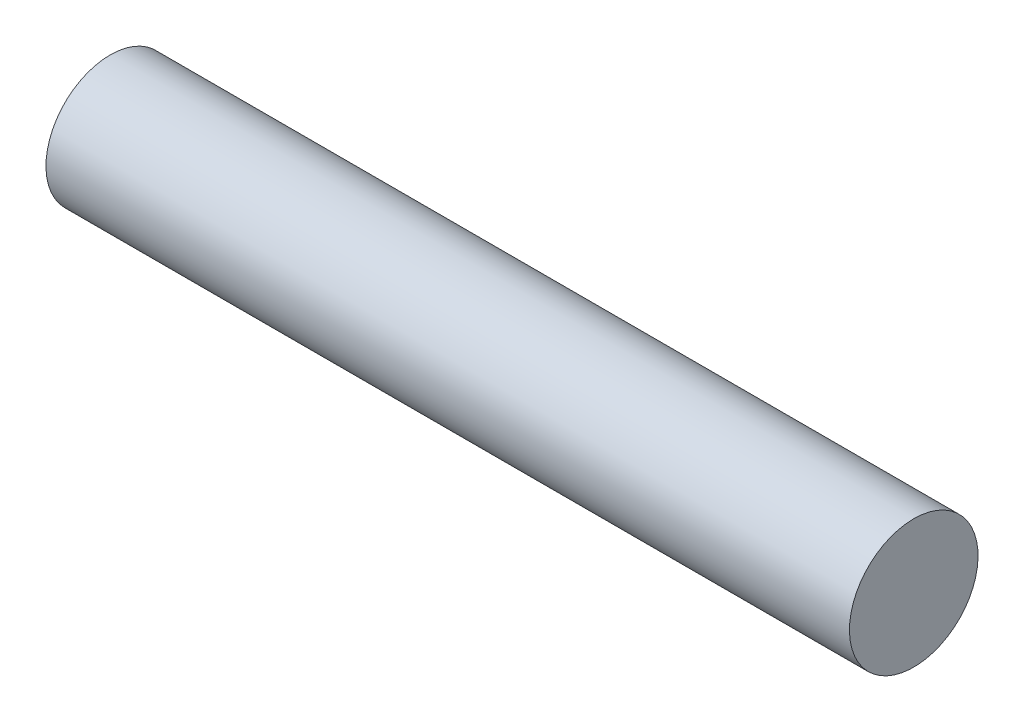
ISO-10303-21;
HEADER;
FILE_DESCRIPTION(('STEP AP214'),'2;1');
FILE_NAME('part.step','',(''),(''),'','','');
FILE_SCHEMA(('AUTOMOTIVE_DESIGN { 1 0 10303 214 1 1 1 1 }'));
ENDSEC;
DATA;
#1=APPLICATION_CONTEXT('core data for automotive mechanical design processes');
#2=APPLICATION_PROTOCOL_DEFINITION('international standard','automotive_design',2000,#1);
#3=PRODUCT_CONTEXT('',#1,'mechanical');
#4=PRODUCT('Part','Part','',(#3));
#5=PRODUCT_RELATED_PRODUCT_CATEGORY('part','',(#4));
#6=PRODUCT_DEFINITION_FORMATION('','',#4);
#7=PRODUCT_DEFINITION_CONTEXT('part definition',#1,'design');
#8=PRODUCT_DEFINITION('design','',#6,#7);
#9=PRODUCT_DEFINITION_SHAPE('','',#8);
#10=(LENGTH_UNIT() NAMED_UNIT(*) SI_UNIT(.MILLI.,.METRE.));
#11=(NAMED_UNIT(*) PLANE_ANGLE_UNIT() SI_UNIT($,.RADIAN.));
#12=(NAMED_UNIT(*) SI_UNIT($,.STERADIAN.) SOLID_ANGLE_UNIT());
#13=UNCERTAINTY_MEASURE_WITH_UNIT(LENGTH_MEASURE(1.E-05),#10,'distance_accuracy_value','');
#14=(GEOMETRIC_REPRESENTATION_CONTEXT(3) GLOBAL_UNCERTAINTY_ASSIGNED_CONTEXT((#13)) GLOBAL_UNIT_ASSIGNED_CONTEXT((#10,
#11,#12)) REPRESENTATION_CONTEXT('',''));
#15=CARTESIAN_POINT('',(0.,0.,0.));
#16=DIRECTION('',(0.,0.,1.));
#17=DIRECTION('',(1.,0.,0.));
#18=AXIS2_PLACEMENT_3D('',#15,#16,#17);
#19=CARTESIAN_POINT('',(0.,0.,0.));
#20=DIRECTION('',(1.,0.,0.));
#21=DIRECTION('',(0.,1.,0.));
#22=AXIS2_PLACEMENT_3D('',#19,#20,#21);
#23=PLANE('',#22);
#24=CARTESIAN_POINT('',(0.,-14.,0.));
#25=DIRECTION('',(1.,0.,0.));
#26=DIRECTION('',(0.,1.,0.));
#27=AXIS2_PLACEMENT_3D('',#24,#25,#26);
#28=CIRCLE('',#27,14.);
#29=CARTESIAN_POINT('',(0.,0.,0.));
#30=VERTEX_POINT('',#29);
#31=EDGE_CURVE('E41',#30,#30,#28,.T.);
#32=ORIENTED_EDGE('',*,*,#31,.T.);
#33=EDGE_LOOP('',(#32));
#34=FACE_BOUND('',#33,.T.);
#35=ADVANCED_FACE('F35',(#34),#23,.T.);
#36=CARTESIAN_POINT('',(-175.,0.,0.));
#37=DIRECTION('',(-1.,0.,0.));
#38=DIRECTION('',(0.,-1.,0.));
#39=AXIS2_PLACEMENT_3D('',#36,#37,#38);
#40=PLANE('',#39);
#41=CARTESIAN_POINT('',(-175.,-14.,0.));
#42=DIRECTION('',(1.,0.,0.));
#43=DIRECTION('',(0.,1.,0.));
#44=AXIS2_PLACEMENT_3D('',#41,#42,#43);
#45=CIRCLE('',#44,14.);
#46=CARTESIAN_POINT('',(-175.,0.,0.));
#47=VERTEX_POINT('',#46);
#48=EDGE_CURVE('E10',#47,#47,#45,.T.);
#49=ORIENTED_EDGE('',*,*,#48,.F.);
#50=EDGE_LOOP('',(#49));
#51=FACE_BOUND('',#50,.T.);
#52=ADVANCED_FACE('F50',(#51),#40,.T.);
#53=CARTESIAN_POINT('',(0.,-14.,0.));
#54=DIRECTION('',(1.,0.,0.));
#55=DIRECTION('',(0.,1.,0.));
#56=AXIS2_PLACEMENT_3D('',#53,#54,#55);
#57=CYLINDRICAL_SURFACE('',#56,14.);
#58=ORIENTED_EDGE('',*,*,#48,.T.);
#59=EDGE_LOOP('',(#58));
#60=FACE_BOUND('',#59,.T.);
#61=ORIENTED_EDGE('',*,*,#31,.F.);
#62=EDGE_LOOP('',(#61));
#63=FACE_BOUND('',#62,.T.);
#64=ADVANCED_FACE('F48',(#60,#63),#57,.T.);
#65=CLOSED_SHELL('',(#35,#52,#64));
#66=MANIFOLD_SOLID_BREP('B2',#65);
#67=ADVANCED_BREP_SHAPE_REPRESENTATION('',(#18,#66),#14);
#68=SHAPE_DEFINITION_REPRESENTATION(#9,#67);
ENDSEC;
END-ISO-10303-21;
